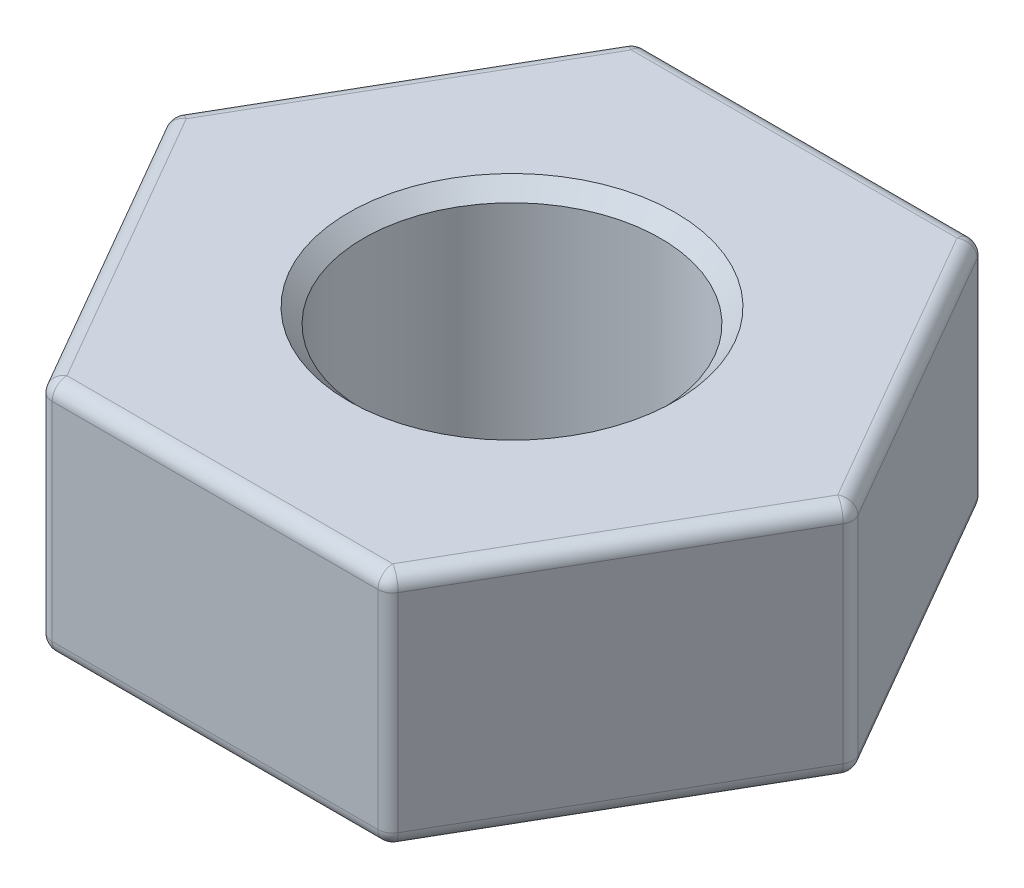
ISO-10303-21;
HEADER;
FILE_DESCRIPTION(('STEP AP214'),'2;1');
FILE_NAME('part.step','',(''),(''),'','','');
FILE_SCHEMA(('AUTOMOTIVE_DESIGN { 1 0 10303 214 1 1 1 1 }'));
ENDSEC;
DATA;
#1=APPLICATION_CONTEXT('core data for automotive mechanical design processes');
#2=APPLICATION_PROTOCOL_DEFINITION('international standard','automotive_design',2000,#1);
#3=PRODUCT_CONTEXT('',#1,'mechanical');
#4=PRODUCT('Part','Part','',(#3));
#5=PRODUCT_RELATED_PRODUCT_CATEGORY('part','',(#4));
#6=PRODUCT_DEFINITION_FORMATION('','',#4);
#7=PRODUCT_DEFINITION_CONTEXT('part definition',#1,'design');
#8=PRODUCT_DEFINITION('design','',#6,#7);
#9=PRODUCT_DEFINITION_SHAPE('','',#8);
#10=(LENGTH_UNIT() NAMED_UNIT(*) SI_UNIT(.MILLI.,.METRE.));
#11=(NAMED_UNIT(*) PLANE_ANGLE_UNIT() SI_UNIT($,.RADIAN.));
#12=(NAMED_UNIT(*) SI_UNIT($,.STERADIAN.) SOLID_ANGLE_UNIT());
#13=UNCERTAINTY_MEASURE_WITH_UNIT(LENGTH_MEASURE(1.E-05),#10,'distance_accuracy_value','');
#14=(GEOMETRIC_REPRESENTATION_CONTEXT(3) GLOBAL_UNCERTAINTY_ASSIGNED_CONTEXT((#13)) GLOBAL_UNIT_ASSIGNED_CONTEXT((#10,
#11,#12)) REPRESENTATION_CONTEXT('',''));
#15=CARTESIAN_POINT('',(0.,0.,0.));
#16=DIRECTION('',(0.,0.,1.));
#17=DIRECTION('',(1.,0.,0.));
#18=AXIS2_PLACEMENT_3D('',#15,#16,#17);
#19=CARTESIAN_POINT('',(0.,1.6,0.));
#20=DIRECTION('',(0.,1.,0.));
#21=DIRECTION('',(0.,0.,1.));
#22=AXIS2_PLACEMENT_3D('',#19,#20,#21);
#23=PLANE('',#22);
#24=CARTESIAN_POINT('',(0.,1.6,0.));
#25=DIRECTION('',(0.,1.,0.));
#26=DIRECTION('',(0.,0.,1.));
#27=AXIS2_PLACEMENT_3D('',#24,#25,#26);
#28=CIRCLE('',#27,1.1);
#29=CARTESIAN_POINT('',(0.,1.6,1.1));
#30=VERTEX_POINT('',#29);
#31=EDGE_CURVE('E11',#30,#30,#28,.F.);
#32=ORIENTED_EDGE('',*,*,#31,.T.);
#33=EDGE_LOOP('',(#32));
#34=FACE_BOUND('',#33,.T.);
#35=DIRECTION('',(-0.499999999999995,0.,0.866025403784442));
#36=VECTOR('',#35,1.);
#37=CARTESIAN_POINT('',(-2.22279853638006,1.6,0.0500000000000157));
#38=LINE('',#37,#36);
#39=CARTESIAN_POINT('',(-1.0969655114603,1.6,-1.9));
#40=VERTEX_POINT('',#39);
#41=CARTESIAN_POINT('',(-2.19393102292058,1.6,0.));
#42=VERTEX_POINT('',#41);
#43=EDGE_CURVE('E58',#40,#42,#38,.T.);
#44=ORIENTED_EDGE('',*,*,#43,.T.);
#45=DIRECTION('',(0.500000000000007,0.,0.866025403784435));
#46=VECTOR('',#45,1.);
#47=CARTESIAN_POINT('',(-1.06809799800079,1.6,1.95000000000001));
#48=LINE('',#47,#46);
#49=CARTESIAN_POINT('',(-1.09696551146027,1.6,1.90000000000001));
#50=VERTEX_POINT('',#49);
#51=EDGE_CURVE('E317',#42,#50,#48,.T.);
#52=ORIENTED_EDGE('',*,*,#51,.T.);
#53=DIRECTION('',(1.,0.,0.));
#54=VECTOR('',#53,1.);
#55=CARTESIAN_POINT('',(1.15470053837927,1.6,1.89999999999999));
#56=LINE('',#55,#54);
#57=CARTESIAN_POINT('',(1.09696551146031,1.6,1.89999999999999));
#58=VERTEX_POINT('',#57);
#59=EDGE_CURVE('E464',#50,#58,#56,.T.);
#60=ORIENTED_EDGE('',*,*,#59,.T.);
#61=DIRECTION('',(0.499999999999995,0.,-0.866025403784442));
#62=VECTOR('',#61,1.);
#63=CARTESIAN_POINT('',(2.22279853638006,1.6,-0.0500000000000001));
#64=LINE('',#63,#62);
#65=CARTESIAN_POINT('',(2.19393102292058,1.6,0.));
#66=VERTEX_POINT('',#65);
#67=EDGE_CURVE('E467',#58,#66,#64,.T.);
#68=ORIENTED_EDGE('',*,*,#67,.T.);
#69=DIRECTION('',(-0.500000000000001,0.,-0.866025403784438));
#70=VECTOR('',#69,1.);
#71=CARTESIAN_POINT('',(1.0680979980008,1.6,-1.95));
#72=LINE('',#71,#70);
#73=CARTESIAN_POINT('',(1.09696551146029,1.6,-1.9));
#74=VERTEX_POINT('',#73);
#75=EDGE_CURVE('E470',#66,#74,#72,.T.);
#76=ORIENTED_EDGE('',*,*,#75,.T.);
#77=DIRECTION('',(-1.,0.,0.));
#78=VECTOR('',#77,1.);
#79=CARTESIAN_POINT('',(-1.15470053837926,1.6,-1.9));
#80=LINE('',#79,#78);
#81=EDGE_CURVE('E63',#74,#40,#80,.T.);
#82=ORIENTED_EDGE('',*,*,#81,.T.);
#83=EDGE_LOOP('',(#44,#52,#60,#68,#76,#82));
#84=FACE_BOUND('',#83,.T.);
#85=ADVANCED_FACE('F41',(#34,#84),#23,.T.);
#86=CARTESIAN_POINT('',(0.,0.,0.));
#87=DIRECTION('',(0.,1.,0.));
#88=DIRECTION('',(0.,0.,1.));
#89=AXIS2_PLACEMENT_3D('',#86,#87,#88);
#90=PLANE('',#89);
#91=CARTESIAN_POINT('',(0.,0.,0.));
#92=DIRECTION('',(0.,1.,0.));
#93=DIRECTION('',(0.,0.,1.));
#94=AXIS2_PLACEMENT_3D('',#91,#92,#93);
#95=CIRCLE('',#94,1.1);
#96=CARTESIAN_POINT('',(0.,0.,1.1));
#97=VERTEX_POINT('',#96);
#98=EDGE_CURVE('E312',#97,#97,#95,.T.);
#99=ORIENTED_EDGE('',*,*,#98,.T.);
#100=EDGE_LOOP('',(#99));
#101=FACE_BOUND('',#100,.T.);
#102=DIRECTION('',(1.,0.,0.));
#103=VECTOR('',#102,1.);
#104=CARTESIAN_POINT('',(0.,0.,1.9));
#105=LINE('',#104,#103);
#106=CARTESIAN_POINT('',(1.09696551146031,0.,1.89999999999999));
#107=VERTEX_POINT('',#106);
#108=CARTESIAN_POINT('',(-1.09696551146027,0.,1.90000000000001));
#109=VERTEX_POINT('',#108);
#110=EDGE_CURVE('E340',#107,#109,#105,.F.);
#111=ORIENTED_EDGE('',*,*,#110,.T.);
#112=DIRECTION('',(0.500000000000007,0.,0.866025403784435));
#113=VECTOR('',#112,1.);
#114=CARTESIAN_POINT('',(-1.64544826719043,0.,0.950000000000013));
#115=LINE('',#114,#113);
#116=CARTESIAN_POINT('',(-2.19393102292058,0.,0.));
#117=VERTEX_POINT('',#116);
#118=EDGE_CURVE('E343',#109,#117,#115,.F.);
#119=ORIENTED_EDGE('',*,*,#118,.T.);
#120=DIRECTION('',(-0.499999999999995,0.,0.866025403784442));
#121=VECTOR('',#120,1.);
#122=CARTESIAN_POINT('',(-1.64544826719044,0.,-0.94999999999999));
#123=LINE('',#122,#121);
#124=CARTESIAN_POINT('',(-1.0969655114603,0.,-1.9));
#125=VERTEX_POINT('',#124);
#126=EDGE_CURVE('E369',#117,#125,#123,.F.);
#127=ORIENTED_EDGE('',*,*,#126,.T.);
#128=DIRECTION('',(-1.,0.,0.));
#129=VECTOR('',#128,1.);
#130=CARTESIAN_POINT('',(0.,0.,-1.9));
#131=LINE('',#130,#129);
#132=CARTESIAN_POINT('',(1.09696551146029,0.,-1.9));
#133=VERTEX_POINT('',#132);
#134=EDGE_CURVE('E396',#125,#133,#131,.F.);
#135=ORIENTED_EDGE('',*,*,#134,.T.);
#136=DIRECTION('',(-0.500000000000001,0.,-0.866025403784438));
#137=VECTOR('',#136,1.);
#138=CARTESIAN_POINT('',(1.64544826719043,0.,-0.950000000000002));
#139=LINE('',#138,#137);
#140=CARTESIAN_POINT('',(2.19393102292058,0.,0.));
#141=VERTEX_POINT('',#140);
#142=EDGE_CURVE('E399',#133,#141,#139,.F.);
#143=ORIENTED_EDGE('',*,*,#142,.T.);
#144=DIRECTION('',(0.499999999999995,0.,-0.866025403784442));
#145=VECTOR('',#144,1.);
#146=CARTESIAN_POINT('',(1.64544826719045,0.,0.949999999999995));
#147=LINE('',#146,#145);
#148=EDGE_CURVE('E345',#141,#107,#147,.F.);
#149=ORIENTED_EDGE('',*,*,#148,.T.);
#150=EDGE_LOOP('',(#111,#119,#127,#135,#143,#149));
#151=FACE_BOUND('',#150,.T.);
#152=ADVANCED_FACE('F333',(#101,#151),#90,.F.);
#153=CARTESIAN_POINT('',(1.15470053837928,1.6,1.99999999999999));
#154=DIRECTION('',(-0.866025403784441,0.,-0.499999999999995));
#155=DIRECTION('',(-0.499999999999995,0.,0.866025403784442));
#156=AXIS2_PLACEMENT_3D('',#153,#154,#155);
#157=PLANE('',#156);
#158=DIRECTION('',(0.,-1.,0.));
#159=VECTOR('',#158,1.);
#160=CARTESIAN_POINT('',(1.18356805183876,1.6,1.94999999999999));
#161=LINE('',#160,#159);
#162=CARTESIAN_POINT('',(1.18356805183876,1.5,1.94999999999999));
#163=VERTEX_POINT('',#162);
#164=CARTESIAN_POINT('',(1.18356805183876,0.1,1.94999999999999));
#165=VERTEX_POINT('',#164);
#166=EDGE_CURVE('E447',#163,#165,#161,.T.);
#167=ORIENTED_EDGE('',*,*,#166,.T.);
#168=DIRECTION('',(0.499999999999995,0.,-0.866025403784442));
#169=VECTOR('',#168,1.);
#170=CARTESIAN_POINT('',(1.15470053837928,0.1,1.99999999999999));
#171=LINE('',#170,#169);
#172=CARTESIAN_POINT('',(2.28053356329902,0.1,0.0499999999999998));
#173=VERTEX_POINT('',#172);
#174=EDGE_CURVE('E450',#165,#173,#171,.T.);
#175=ORIENTED_EDGE('',*,*,#174,.T.);
#176=DIRECTION('',(0.,-1.,0.));
#177=VECTOR('',#176,1.);
#178=CARTESIAN_POINT('',(2.28053356329902,1.6,0.0499999999999997));
#179=LINE('',#178,#177);
#180=CARTESIAN_POINT('',(2.28053356329902,1.5,0.0499999999999998));
#181=VERTEX_POINT('',#180);
#182=EDGE_CURVE('E444',#173,#181,#179,.F.);
#183=ORIENTED_EDGE('',*,*,#182,.T.);
#184=DIRECTION('',(0.499999999999995,0.,-0.866025403784442));
#185=VECTOR('',#184,1.);
#186=CARTESIAN_POINT('',(1.15470053837928,1.5,1.99999999999999));
#187=LINE('',#186,#185);
#188=EDGE_CURVE('E441',#181,#163,#187,.F.);
#189=ORIENTED_EDGE('',*,*,#188,.T.);
#190=EDGE_LOOP('',(#167,#175,#183,#189));
#191=FACE_BOUND('',#190,.T.);
#192=ADVANCED_FACE('F336',(#191),#157,.F.);
#193=CARTESIAN_POINT('',(2.30940107675851,1.6,0.));
#194=DIRECTION('',(-0.866025403784438,0.,0.500000000000001));
#195=DIRECTION('',(0.500000000000001,0.,0.866025403784438));
#196=AXIS2_PLACEMENT_3D('',#193,#194,#195);
#197=PLANE('',#196);
#198=DIRECTION('',(0.,-1.,0.));
#199=VECTOR('',#198,1.);
#200=CARTESIAN_POINT('',(2.28053356329902,1.6,-0.0499999999999998));
#201=LINE('',#200,#199);
#202=CARTESIAN_POINT('',(2.28053356329902,1.5,-0.0499999999999998));
#203=VERTEX_POINT('',#202);
#204=CARTESIAN_POINT('',(2.28053356329902,0.1,-0.0499999999999998));
#205=VERTEX_POINT('',#204);
#206=EDGE_CURVE('E431',#203,#205,#201,.T.);
#207=ORIENTED_EDGE('',*,*,#206,.T.);
#208=DIRECTION('',(-0.500000000000001,0.,-0.866025403784438));
#209=VECTOR('',#208,1.);
#210=CARTESIAN_POINT('',(2.30940107675851,0.1,0.));
#211=LINE('',#210,#209);
#212=CARTESIAN_POINT('',(1.18356805183873,0.1,-1.95));
#213=VERTEX_POINT('',#212);
#214=EDGE_CURVE('E437',#205,#213,#211,.T.);
#215=ORIENTED_EDGE('',*,*,#214,.T.);
#216=DIRECTION('',(0.,-1.,0.));
#217=VECTOR('',#216,1.);
#218=CARTESIAN_POINT('',(1.18356805183873,1.6,-1.95));
#219=LINE('',#218,#217);
#220=CARTESIAN_POINT('',(1.18356805183873,1.5,-1.95));
#221=VERTEX_POINT('',#220);
#222=EDGE_CURVE('E434',#213,#221,#219,.F.);
#223=ORIENTED_EDGE('',*,*,#222,.T.);
#224=DIRECTION('',(-0.500000000000001,0.,-0.866025403784438));
#225=VECTOR('',#224,1.);
#226=CARTESIAN_POINT('',(2.30940107675851,1.5,0.));
#227=LINE('',#226,#225);
#228=EDGE_CURVE('E428',#221,#203,#227,.F.);
#229=ORIENTED_EDGE('',*,*,#228,.T.);
#230=EDGE_LOOP('',(#207,#215,#223,#229));
#231=FACE_BOUND('',#230,.T.);
#232=ADVANCED_FACE('F543',(#231),#197,.F.);
#233=CARTESIAN_POINT('',(1.15470053837925,1.6,-2.));
#234=DIRECTION('',(0.,0.,1.));
#235=DIRECTION('',(1.,0.,0.));
#236=AXIS2_PLACEMENT_3D('',#233,#234,#235);
#237=PLANE('',#236);
#238=DIRECTION('',(0.,-1.,0.));
#239=VECTOR('',#238,1.);
#240=CARTESIAN_POINT('',(1.09696551146029,1.6,-2.));
#241=LINE('',#240,#239);
#242=CARTESIAN_POINT('',(1.09696551146029,1.5,-2.));
#243=VERTEX_POINT('',#242);
#244=CARTESIAN_POINT('',(1.09696551146029,0.1,-2.));
#245=VERTEX_POINT('',#244);
#246=EDGE_CURVE('E418',#243,#245,#241,.T.);
#247=ORIENTED_EDGE('',*,*,#246,.T.);
#248=DIRECTION('',(-1.,0.,0.));
#249=VECTOR('',#248,1.);
#250=CARTESIAN_POINT('',(1.15470053837925,0.1,-2.));
#251=LINE('',#250,#249);
#252=CARTESIAN_POINT('',(-1.0969655114603,0.1,-2.));
#253=VERTEX_POINT('',#252);
#254=EDGE_CURVE('E424',#245,#253,#251,.T.);
#255=ORIENTED_EDGE('',*,*,#254,.T.);
#256=DIRECTION('',(0.,-1.,0.));
#257=VECTOR('',#256,1.);
#258=CARTESIAN_POINT('',(-1.0969655114603,1.6,-2.));
#259=LINE('',#258,#257);
#260=CARTESIAN_POINT('',(-1.0969655114603,1.5,-2.));
#261=VERTEX_POINT('',#260);
#262=EDGE_CURVE('E421',#253,#261,#259,.F.);
#263=ORIENTED_EDGE('',*,*,#262,.T.);
#264=DIRECTION('',(-1.,0.,0.));
#265=VECTOR('',#264,1.);
#266=CARTESIAN_POINT('',(1.15470053837925,1.5,-2.));
#267=LINE('',#266,#265);
#268=EDGE_CURVE('E415',#261,#243,#267,.F.);
#269=ORIENTED_EDGE('',*,*,#268,.T.);
#270=EDGE_LOOP('',(#247,#255,#263,#269));
#271=FACE_BOUND('',#270,.T.);
#272=ADVANCED_FACE('F554',(#271),#237,.F.);
#273=CARTESIAN_POINT('',(-1.15470053837926,1.6,-2.));
#274=DIRECTION('',(0.866025403784442,0.,0.499999999999995));
#275=DIRECTION('',(0.499999999999995,0.,-0.866025403784442));
#276=AXIS2_PLACEMENT_3D('',#273,#274,#275);
#277=PLANE('',#276);
#278=DIRECTION('',(0.,-1.,0.));
#279=VECTOR('',#278,1.);
#280=CARTESIAN_POINT('',(-1.18356805183874,1.6,-1.95));
#281=LINE('',#280,#279);
#282=CARTESIAN_POINT('',(-1.18356805183874,1.5,-1.95));
#283=VERTEX_POINT('',#282);
#284=CARTESIAN_POINT('',(-1.18356805183874,0.1,-1.95));
#285=VERTEX_POINT('',#284);
#286=EDGE_CURVE('E405',#283,#285,#281,.T.);
#287=ORIENTED_EDGE('',*,*,#286,.T.);
#288=DIRECTION('',(-0.499999999999995,0.,0.866025403784442));
#289=VECTOR('',#288,1.);
#290=CARTESIAN_POINT('',(-1.15470053837926,0.1,-2.));
#291=LINE('',#290,#289);
#292=CARTESIAN_POINT('',(-2.28053356329902,0.1,-0.0499999999999842));
#293=VERTEX_POINT('',#292);
#294=EDGE_CURVE('E411',#285,#293,#291,.T.);
#295=ORIENTED_EDGE('',*,*,#294,.T.);
#296=DIRECTION('',(0.,-1.,0.));
#297=VECTOR('',#296,1.);
#298=CARTESIAN_POINT('',(-2.28053356329902,1.6,-0.0499999999999845));
#299=LINE('',#298,#297);
#300=CARTESIAN_POINT('',(-2.28053356329902,1.5,-0.0499999999999842));
#301=VERTEX_POINT('',#300);
#302=EDGE_CURVE('E408',#293,#301,#299,.F.);
#303=ORIENTED_EDGE('',*,*,#302,.T.);
#304=DIRECTION('',(-0.499999999999995,0.,0.866025403784442));
#305=VECTOR('',#304,1.);
#306=CARTESIAN_POINT('',(-1.15470053837926,1.5,-2.));
#307=LINE('',#306,#305);
#308=EDGE_CURVE('E368',#301,#283,#307,.F.);
#309=ORIENTED_EDGE('',*,*,#308,.T.);
#310=EDGE_LOOP('',(#287,#295,#303,#309));
#311=FACE_BOUND('',#310,.T.);
#312=ADVANCED_FACE('F569',(#311),#277,.F.);
#313=CARTESIAN_POINT('',(-2.3094010767585,1.6,0.));
#314=DIRECTION('',(0.866025403784435,0.,-0.500000000000007));
#315=DIRECTION('',(-0.500000000000007,0.,-0.866025403784435));
#316=AXIS2_PLACEMENT_3D('',#313,#314,#315);
#317=PLANE('',#316);
#318=DIRECTION('',(0.,-1.,0.));
#319=VECTOR('',#318,1.);
#320=CARTESIAN_POINT('',(-2.28053356329902,1.6,0.0500000000000159));
#321=LINE('',#320,#319);
#322=CARTESIAN_POINT('',(-2.28053356329902,1.5,0.0500000000000159));
#323=VERTEX_POINT('',#322);
#324=CARTESIAN_POINT('',(-2.28053356329902,0.1,0.0500000000000159));
#325=VERTEX_POINT('',#324);
#326=EDGE_CURVE('E179',#323,#325,#321,.T.);
#327=ORIENTED_EDGE('',*,*,#326,.T.);
#328=DIRECTION('',(0.500000000000007,0.,0.866025403784435));
#329=VECTOR('',#328,1.);
#330=CARTESIAN_POINT('',(-2.3094010767585,0.1,0.));
#331=LINE('',#330,#329);
#332=CARTESIAN_POINT('',(-1.18356805183872,0.1,1.95000000000001));
#333=VERTEX_POINT('',#332);
#334=EDGE_CURVE('E174',#325,#333,#331,.T.);
#335=ORIENTED_EDGE('',*,*,#334,.T.);
#336=DIRECTION('',(0.,-1.,0.));
#337=VECTOR('',#336,1.);
#338=CARTESIAN_POINT('',(-1.18356805183872,1.6,1.95000000000001));
#339=LINE('',#338,#337);
#340=CARTESIAN_POINT('',(-1.18356805183872,1.5,1.95000000000001));
#341=VERTEX_POINT('',#340);
#342=EDGE_CURVE('E168',#333,#341,#339,.F.);
#343=ORIENTED_EDGE('',*,*,#342,.T.);
#344=DIRECTION('',(0.500000000000007,0.,0.866025403784435));
#345=VECTOR('',#344,1.);
#346=CARTESIAN_POINT('',(-2.3094010767585,1.5,0.));
#347=LINE('',#346,#345);
#348=EDGE_CURVE('E171',#341,#323,#347,.F.);
#349=ORIENTED_EDGE('',*,*,#348,.T.);
#350=EDGE_LOOP('',(#327,#335,#343,#349));
#351=FACE_BOUND('',#350,.T.);
#352=ADVANCED_FACE('F170',(#351),#317,.F.);
#353=CARTESIAN_POINT('',(-1.15470053837923,1.6,2.00000000000001));
#354=DIRECTION('',(0.,0.,-1.));
#355=DIRECTION('',(-1.,0.,0.));
#356=AXIS2_PLACEMENT_3D('',#353,#354,#355);
#357=PLANE('',#356);
#358=DIRECTION('',(0.,-1.,0.));
#359=VECTOR('',#358,1.);
#360=CARTESIAN_POINT('',(-1.09696551146027,1.6,2.00000000000001));
#361=LINE('',#360,#359);
#362=CARTESIAN_POINT('',(-1.09696551146027,1.5,2.00000000000001));
#363=VERTEX_POINT('',#362);
#364=CARTESIAN_POINT('',(-1.09696551146027,0.1,2.00000000000001));
#365=VERTEX_POINT('',#364);
#366=EDGE_CURVE('E203',#363,#365,#361,.T.);
#367=ORIENTED_EDGE('',*,*,#366,.T.);
#368=DIRECTION('',(1.,0.,0.));
#369=VECTOR('',#368,1.);
#370=CARTESIAN_POINT('',(-1.15470053837923,0.1,2.00000000000001));
#371=LINE('',#370,#369);
#372=CARTESIAN_POINT('',(1.09696551146031,0.1,1.99999999999999));
#373=VERTEX_POINT('',#372);
#374=EDGE_CURVE('E355',#365,#373,#371,.T.);
#375=ORIENTED_EDGE('',*,*,#374,.T.);
#376=DIRECTION('',(0.,-1.,0.));
#377=VECTOR('',#376,1.);
#378=CARTESIAN_POINT('',(1.09696551146031,1.6,1.99999999999999));
#379=LINE('',#378,#377);
#380=CARTESIAN_POINT('',(1.09696551146031,1.5,1.99999999999999));
#381=VERTEX_POINT('',#380);
#382=EDGE_CURVE('E459',#373,#381,#379,.F.);
#383=ORIENTED_EDGE('',*,*,#382,.T.);
#384=DIRECTION('',(1.,0.,0.));
#385=VECTOR('',#384,1.);
#386=CARTESIAN_POINT('',(-1.15470053837923,1.5,2.00000000000001));
#387=LINE('',#386,#385);
#388=EDGE_CURVE('E454',#381,#363,#387,.F.);
#389=ORIENTED_EDGE('',*,*,#388,.T.);
#390=EDGE_LOOP('',(#367,#375,#383,#389));
#391=FACE_BOUND('',#390,.T.);
#392=ADVANCED_FACE('F518',(#391),#357,.F.);
#393=CARTESIAN_POINT('',(0.,1.6,0.));
#394=DIRECTION('',(0.,-1.,0.));
#395=DIRECTION('',(0.,0.,-1.));
#396=AXIS2_PLACEMENT_3D('',#393,#394,#395);
#397=CYLINDRICAL_SURFACE('',#396,1.);
#398=CARTESIAN_POINT('',(0.,0.100000000000001,0.));
#399=DIRECTION('',(0.,1.,0.));
#400=DIRECTION('',(0.,0.,1.));
#401=AXIS2_PLACEMENT_3D('',#398,#399,#400);
#402=CIRCLE('',#401,1.);
#403=CARTESIAN_POINT('',(0.,0.100000000000001,1.));
#404=VERTEX_POINT('',#403);
#405=EDGE_CURVE('E51',#404,#404,#402,.F.);
#406=ORIENTED_EDGE('',*,*,#405,.T.);
#407=EDGE_LOOP('',(#406));
#408=FACE_BOUND('',#407,.T.);
#409=CARTESIAN_POINT('',(0.,1.5,0.));
#410=DIRECTION('',(0.,1.,0.));
#411=DIRECTION('',(0.,0.,1.));
#412=AXIS2_PLACEMENT_3D('',#409,#410,#411);
#413=CIRCLE('',#412,1.);
#414=CARTESIAN_POINT('',(0.,1.5,1.));
#415=VERTEX_POINT('',#414);
#416=EDGE_CURVE('E316',#415,#415,#413,.T.);
#417=ORIENTED_EDGE('',*,*,#416,.T.);
#418=EDGE_LOOP('',(#417));
#419=FACE_BOUND('',#418,.T.);
#420=ADVANCED_FACE('F324',(#408,#419),#397,.F.);
#421=CARTESIAN_POINT('',(1.64544826719043,1.5,-0.950000000000002));
#422=DIRECTION('',(0.500000000000001,0.,0.866025403784438));
#423=DIRECTION('',(0.866025403784438,0.,-0.500000000000001));
#424=AXIS2_PLACEMENT_3D('',#421,#422,#423);
#425=CYLINDRICAL_SURFACE('',#424,0.1);
#426=CARTESIAN_POINT('',(1.09696551146029,1.5,-1.9));
#427=DIRECTION('',(-0.499999999999999,0.,-0.866025403784439));
#428=DIRECTION('',(-0.866025403784439,0.,0.499999999999999));
#429=AXIS2_PLACEMENT_3D('',#426,#427,#428);
#430=CIRCLE('',#429,0.1);
#431=EDGE_CURVE('E191',#74,#221,#430,.T.);
#432=ORIENTED_EDGE('',*,*,#431,.F.);
#433=ORIENTED_EDGE('',*,*,#75,.F.);
#434=CARTESIAN_POINT('',(2.19393102292058,1.5,0.));
#435=DIRECTION('',(0.500000000000002,0.,0.866025403784438));
#436=DIRECTION('',(0.866025403784438,0.,-0.500000000000002));
#437=AXIS2_PLACEMENT_3D('',#434,#435,#436);
#438=CIRCLE('',#437,0.1);
#439=EDGE_CURVE('E305',#203,#66,#438,.T.);
#440=ORIENTED_EDGE('',*,*,#439,.F.);
#441=ORIENTED_EDGE('',*,*,#228,.F.);
#442=EDGE_LOOP('',(#432,#433,#440,#441));
#443=FACE_BOUND('',#442,.T.);
#444=ADVANCED_FACE('F533',(#443),#425,.T.);
#445=CARTESIAN_POINT('',(1.09696551146029,1.5,-1.9));
#446=DIRECTION('',(0.,0.,1.));
#447=DIRECTION('',(1.,0.,0.));
#448=AXIS2_PLACEMENT_3D('',#445,#446,#447);
#449=SPHERICAL_SURFACE('',#448,0.1);
#450=CARTESIAN_POINT('',(1.09696551146029,1.5,-1.9));
#451=DIRECTION('',(1.,0.,0.));
#452=DIRECTION('',(0.,0.,-1.));
#453=AXIS2_PLACEMENT_3D('',#450,#451,#452);
#454=CIRCLE('',#453,0.1);
#455=EDGE_CURVE('E297',#74,#243,#454,.F.);
#456=ORIENTED_EDGE('',*,*,#455,.F.);
#457=ORIENTED_EDGE('',*,*,#431,.T.);
#458=CARTESIAN_POINT('',(1.09696551146029,1.5,-1.9));
#459=DIRECTION('',(0.,1.,0.));
#460=DIRECTION('',(0.,0.,1.));
#461=AXIS2_PLACEMENT_3D('',#458,#459,#460);
#462=CIRCLE('',#461,0.1);
#463=EDGE_CURVE('E301',#243,#221,#462,.F.);
#464=ORIENTED_EDGE('',*,*,#463,.F.);
#465=EDGE_LOOP('',(#456,#457,#464));
#466=FACE_BOUND('',#465,.T.);
#467=ADVANCED_FACE('F547',(#466),#449,.T.);
#468=CARTESIAN_POINT('',(2.19393102292058,1.5,0.));
#469=DIRECTION('',(0.,0.,1.));
#470=DIRECTION('',(1.,0.,0.));
#471=AXIS2_PLACEMENT_3D('',#468,#469,#470);
#472=SPHERICAL_SURFACE('',#471,0.1);
#473=CARTESIAN_POINT('',(2.19393102292058,1.5,0.));
#474=DIRECTION('',(0.,1.,0.));
#475=DIRECTION('',(0.,0.,1.));
#476=AXIS2_PLACEMENT_3D('',#473,#474,#475);
#477=CIRCLE('',#476,0.1);
#478=EDGE_CURVE('E289',#203,#181,#477,.F.);
#479=ORIENTED_EDGE('',*,*,#478,.F.);
#480=ORIENTED_EDGE('',*,*,#439,.T.);
#481=CARTESIAN_POINT('',(2.19393102292058,1.5,0.));
#482=DIRECTION('',(0.499999999999997,0.,-0.86602540378444));
#483=DIRECTION('',(-0.86602540378444,0.,-0.499999999999997));
#484=AXIS2_PLACEMENT_3D('',#481,#482,#483);
#485=CIRCLE('',#484,0.1);
#486=EDGE_CURVE('E293',#181,#66,#485,.F.);
#487=ORIENTED_EDGE('',*,*,#486,.F.);
#488=EDGE_LOOP('',(#479,#480,#487));
#489=FACE_BOUND('',#488,.T.);
#490=ADVANCED_FACE('F538',(#489),#472,.T.);
#491=CARTESIAN_POINT('',(1.09696551146029,1.6,-1.9));
#492=DIRECTION('',(0.,-1.,0.));
#493=DIRECTION('',(0.,0.,-1.));
#494=AXIS2_PLACEMENT_3D('',#491,#492,#493);
#495=CYLINDRICAL_SURFACE('',#494,0.1);
#496=ORIENTED_EDGE('',*,*,#463,.T.);
#497=ORIENTED_EDGE('',*,*,#222,.F.);
#498=CARTESIAN_POINT('',(1.09696551146029,0.1,-1.9));
#499=DIRECTION('',(0.,-1.,0.));
#500=DIRECTION('',(0.,0.,-1.));
#501=AXIS2_PLACEMENT_3D('',#498,#499,#500);
#502=CIRCLE('',#501,0.1);
#503=EDGE_CURVE('E282',#245,#213,#502,.T.);
#504=ORIENTED_EDGE('',*,*,#503,.F.);
#505=ORIENTED_EDGE('',*,*,#246,.F.);
#506=EDGE_LOOP('',(#496,#497,#504,#505));
#507=FACE_BOUND('',#506,.T.);
#508=ADVANCED_FACE('F550',(#507),#495,.T.);
#509=CARTESIAN_POINT('',(0.,1.5,-1.9));
#510=DIRECTION('',(1.,0.,0.));
#511=DIRECTION('',(0.,0.,-1.));
#512=AXIS2_PLACEMENT_3D('',#509,#510,#511);
#513=CYLINDRICAL_SURFACE('',#512,0.1);
#514=ORIENTED_EDGE('',*,*,#455,.T.);
#515=ORIENTED_EDGE('',*,*,#268,.F.);
#516=CARTESIAN_POINT('',(-1.0969655114603,1.5,-1.9));
#517=DIRECTION('',(-1.,0.,0.));
#518=DIRECTION('',(0.,0.,1.));
#519=AXIS2_PLACEMENT_3D('',#516,#517,#518);
#520=CIRCLE('',#519,0.1);
#521=EDGE_CURVE('E278',#40,#261,#520,.T.);
#522=ORIENTED_EDGE('',*,*,#521,.F.);
#523=ORIENTED_EDGE('',*,*,#81,.F.);
#524=EDGE_LOOP('',(#514,#515,#522,#523));
#525=FACE_BOUND('',#524,.T.);
#526=ADVANCED_FACE('F559',(#525),#513,.T.);
#527=CARTESIAN_POINT('',(1.64544826719045,1.5,0.949999999999995));
#528=DIRECTION('',(-0.499999999999995,0.,0.866025403784442));
#529=DIRECTION('',(0.866025403784441,0.,0.499999999999995));
#530=AXIS2_PLACEMENT_3D('',#527,#528,#529);
#531=CYLINDRICAL_SURFACE('',#530,0.1);
#532=ORIENTED_EDGE('',*,*,#486,.T.);
#533=ORIENTED_EDGE('',*,*,#67,.F.);
#534=CARTESIAN_POINT('',(1.09696551146031,1.5,1.89999999999999));
#535=DIRECTION('',(-0.499999999999995,0.,0.866025403784441));
#536=DIRECTION('',(0.866025403784441,0.,0.499999999999995));
#537=AXIS2_PLACEMENT_3D('',#534,#535,#536);
#538=CIRCLE('',#537,0.1);
#539=EDGE_CURVE('E274',#163,#58,#538,.T.);
#540=ORIENTED_EDGE('',*,*,#539,.F.);
#541=ORIENTED_EDGE('',*,*,#188,.F.);
#542=EDGE_LOOP('',(#532,#533,#540,#541));
#543=FACE_BOUND('',#542,.T.);
#544=ADVANCED_FACE('F527',(#543),#531,.T.);
#545=CARTESIAN_POINT('',(2.19393102292058,1.6,0.));
#546=DIRECTION('',(0.,-1.,0.));
#547=DIRECTION('',(0.,0.,-1.));
#548=AXIS2_PLACEMENT_3D('',#545,#546,#547);
#549=CYLINDRICAL_SURFACE('',#548,0.1);
#550=ORIENTED_EDGE('',*,*,#478,.T.);
#551=ORIENTED_EDGE('',*,*,#182,.F.);
#552=CARTESIAN_POINT('',(2.19393102292058,0.1,0.));
#553=DIRECTION('',(0.,-1.,0.));
#554=DIRECTION('',(0.,0.,-1.));
#555=AXIS2_PLACEMENT_3D('',#552,#553,#554);
#556=CIRCLE('',#555,0.1);
#557=EDGE_CURVE('E270',#205,#173,#556,.T.);
#558=ORIENTED_EDGE('',*,*,#557,.F.);
#559=ORIENTED_EDGE('',*,*,#206,.F.);
#560=EDGE_LOOP('',(#550,#551,#558,#559));
#561=FACE_BOUND('',#560,.T.);
#562=ADVANCED_FACE('F541',(#561),#549,.T.);
#563=CARTESIAN_POINT('',(2.22279853638006,0.1,0.0500000000000001));
#564=DIRECTION('',(-0.500000000000001,0.,-0.866025403784438));
#565=DIRECTION('',(-0.866025403784438,0.,0.500000000000001));
#566=AXIS2_PLACEMENT_3D('',#563,#564,#565);
#567=CYLINDRICAL_SURFACE('',#566,0.1);
#568=CARTESIAN_POINT('',(1.09696551146029,0.1,-1.9));
#569=DIRECTION('',(-0.500000000000001,0.,-0.866025403784438));
#570=DIRECTION('',(-0.866025403784438,0.,0.500000000000001));
#571=AXIS2_PLACEMENT_3D('',#568,#569,#570);
#572=CIRCLE('',#571,0.1);
#573=EDGE_CURVE('E285',#213,#133,#572,.T.);
#574=ORIENTED_EDGE('',*,*,#573,.F.);
#575=ORIENTED_EDGE('',*,*,#214,.F.);
#576=CARTESIAN_POINT('',(2.19393102292058,0.1,0.));
#577=DIRECTION('',(0.500000000000001,0.,0.866025403784438));
#578=DIRECTION('',(0.866025403784438,0.,-0.500000000000001));
#579=AXIS2_PLACEMENT_3D('',#576,#577,#578);
#580=CIRCLE('',#579,0.1);
#581=EDGE_CURVE('E266',#141,#205,#580,.T.);
#582=ORIENTED_EDGE('',*,*,#581,.F.);
#583=ORIENTED_EDGE('',*,*,#142,.F.);
#584=EDGE_LOOP('',(#574,#575,#582,#583));
#585=FACE_BOUND('',#584,.T.);
#586=ADVANCED_FACE('F499',(#585),#567,.T.);
#587=CARTESIAN_POINT('',(1.09696551146029,0.1,-1.9));
#588=DIRECTION('',(0.,0.,1.));
#589=DIRECTION('',(1.,0.,0.));
#590=AXIS2_PLACEMENT_3D('',#587,#588,#589);
#591=SPHERICAL_SURFACE('',#590,0.1);
#592=ORIENTED_EDGE('',*,*,#503,.T.);
#593=ORIENTED_EDGE('',*,*,#573,.T.);
#594=CARTESIAN_POINT('',(1.09696551146029,0.1,-1.9));
#595=DIRECTION('',(1.,0.,0.));
#596=DIRECTION('',(0.,0.,-1.));
#597=AXIS2_PLACEMENT_3D('',#594,#595,#596);
#598=CIRCLE('',#597,0.1);
#599=EDGE_CURVE('E262',#245,#133,#598,.F.);
#600=ORIENTED_EDGE('',*,*,#599,.F.);
#601=EDGE_LOOP('',(#592,#593,#600));
#602=FACE_BOUND('',#601,.T.);
#603=ADVANCED_FACE('F615',(#602),#591,.T.);
#604=CARTESIAN_POINT('',(-1.0969655114603,1.5,-1.9));
#605=DIRECTION('',(0.,0.,1.));
#606=DIRECTION('',(1.,0.,0.));
#607=AXIS2_PLACEMENT_3D('',#604,#605,#606);
#608=SPHERICAL_SURFACE('',#607,0.1);
#609=CARTESIAN_POINT('',(-1.0969655114603,1.5,-1.9));
#610=DIRECTION('',(0.499999999999995,0.,-0.866025403784441));
#611=DIRECTION('',(-0.866025403784441,0.,-0.499999999999995));
#612=AXIS2_PLACEMENT_3D('',#609,#610,#611);
#613=CIRCLE('',#612,0.1);
#614=EDGE_CURVE('E254',#40,#283,#613,.F.);
#615=ORIENTED_EDGE('',*,*,#614,.F.);
#616=ORIENTED_EDGE('',*,*,#521,.T.);
#617=CARTESIAN_POINT('',(-1.0969655114603,1.5,-1.9));
#618=DIRECTION('',(0.,1.,0.));
#619=DIRECTION('',(0.,0.,1.));
#620=AXIS2_PLACEMENT_3D('',#617,#618,#619);
#621=CIRCLE('',#620,0.1);
#622=EDGE_CURVE('E258',#283,#261,#621,.F.);
#623=ORIENTED_EDGE('',*,*,#622,.F.);
#624=EDGE_LOOP('',(#615,#616,#623));
#625=FACE_BOUND('',#624,.T.);
#626=ADVANCED_FACE('F563',(#625),#608,.T.);
#627=CARTESIAN_POINT('',(1.09696551146031,1.5,1.89999999999999));
#628=DIRECTION('',(0.,0.,1.));
#629=DIRECTION('',(1.,0.,0.));
#630=AXIS2_PLACEMENT_3D('',#627,#628,#629);
#631=SPHERICAL_SURFACE('',#630,0.1);
#632=CARTESIAN_POINT('',(1.09696551146031,1.5,1.89999999999999));
#633=DIRECTION('',(0.,1.,0.));
#634=DIRECTION('',(0.,0.,1.));
#635=AXIS2_PLACEMENT_3D('',#632,#633,#634);
#636=CIRCLE('',#635,0.1);
#637=EDGE_CURVE('E246',#163,#381,#636,.F.);
#638=ORIENTED_EDGE('',*,*,#637,.F.);
#639=ORIENTED_EDGE('',*,*,#539,.T.);
#640=CARTESIAN_POINT('',(1.09696551146031,1.5,1.89999999999999));
#641=DIRECTION('',(1.,0.,0.));
#642=DIRECTION('',(0.,0.,-1.));
#643=AXIS2_PLACEMENT_3D('',#640,#641,#642);
#644=CIRCLE('',#643,0.1);
#645=EDGE_CURVE('E250',#381,#58,#644,.F.);
#646=ORIENTED_EDGE('',*,*,#645,.F.);
#647=EDGE_LOOP('',(#638,#639,#646));
#648=FACE_BOUND('',#647,.T.);
#649=ADVANCED_FACE('F523',(#648),#631,.T.);
#650=CARTESIAN_POINT('',(2.19393102292058,0.1,0.));
#651=DIRECTION('',(0.,0.,1.));
#652=DIRECTION('',(1.,0.,0.));
#653=AXIS2_PLACEMENT_3D('',#650,#651,#652);
#654=SPHERICAL_SURFACE('',#653,0.1);
#655=ORIENTED_EDGE('',*,*,#581,.T.);
#656=ORIENTED_EDGE('',*,*,#557,.T.);
#657=CARTESIAN_POINT('',(2.19393102292058,0.1,0.));
#658=DIRECTION('',(0.499999999999995,0.,-0.866025403784441));
#659=DIRECTION('',(-0.866025403784441,0.,-0.499999999999995));
#660=AXIS2_PLACEMENT_3D('',#657,#658,#659);
#661=CIRCLE('',#660,0.1);
#662=EDGE_CURVE('E243',#141,#173,#661,.F.);
#663=ORIENTED_EDGE('',*,*,#662,.F.);
#664=EDGE_LOOP('',(#655,#656,#663));
#665=FACE_BOUND('',#664,.T.);
#666=ADVANCED_FACE('F502',(#665),#654,.T.);
#667=CARTESIAN_POINT('',(1.15470053837925,0.1,-1.9));
#668=DIRECTION('',(-1.,0.,0.));
#669=DIRECTION('',(0.,0.,1.));
#670=AXIS2_PLACEMENT_3D('',#667,#668,#669);
#671=CYLINDRICAL_SURFACE('',#670,0.1);
#672=ORIENTED_EDGE('',*,*,#599,.T.);
#673=ORIENTED_EDGE('',*,*,#134,.F.);
#674=CARTESIAN_POINT('',(-1.0969655114603,0.1,-1.9));
#675=DIRECTION('',(-1.,0.,0.));
#676=DIRECTION('',(0.,0.,1.));
#677=AXIS2_PLACEMENT_3D('',#674,#675,#676);
#678=CIRCLE('',#677,0.1);
#679=EDGE_CURVE('E239',#253,#125,#678,.T.);
#680=ORIENTED_EDGE('',*,*,#679,.F.);
#681=ORIENTED_EDGE('',*,*,#254,.F.);
#682=EDGE_LOOP('',(#672,#673,#680,#681));
#683=FACE_BOUND('',#682,.T.);
#684=ADVANCED_FACE('F625',(#683),#671,.T.);
#685=CARTESIAN_POINT('',(-1.0969655114603,1.6,-1.9));
#686=DIRECTION('',(0.,-1.,0.));
#687=DIRECTION('',(0.,0.,-1.));
#688=AXIS2_PLACEMENT_3D('',#685,#686,#687);
#689=CYLINDRICAL_SURFACE('',#688,0.1);
#690=ORIENTED_EDGE('',*,*,#622,.T.);
#691=ORIENTED_EDGE('',*,*,#262,.F.);
#692=CARTESIAN_POINT('',(-1.0969655114603,0.1,-1.9));
#693=DIRECTION('',(0.,-1.,0.));
#694=DIRECTION('',(0.,0.,-1.));
#695=AXIS2_PLACEMENT_3D('',#692,#693,#694);
#696=CIRCLE('',#695,0.1);
#697=EDGE_CURVE('E236',#285,#253,#696,.T.);
#698=ORIENTED_EDGE('',*,*,#697,.F.);
#699=ORIENTED_EDGE('',*,*,#286,.F.);
#700=EDGE_LOOP('',(#690,#691,#698,#699));
#701=FACE_BOUND('',#700,.T.);
#702=ADVANCED_FACE('F567',(#701),#689,.T.);
#703=CARTESIAN_POINT('',(-1.64544826719044,1.5,-0.94999999999999));
#704=DIRECTION('',(0.499999999999995,0.,-0.866025403784442));
#705=DIRECTION('',(-0.866025403784442,0.,-0.499999999999995));
#706=AXIS2_PLACEMENT_3D('',#703,#704,#705);
#707=CYLINDRICAL_SURFACE('',#706,0.1);
#708=ORIENTED_EDGE('',*,*,#614,.T.);
#709=ORIENTED_EDGE('',*,*,#308,.F.);
#710=CARTESIAN_POINT('',(-2.19393102292058,1.5,0.));
#711=DIRECTION('',(-0.499999999999994,0.,0.866025403784442));
#712=DIRECTION('',(0.866025403784442,0.,0.499999999999994));
#713=AXIS2_PLACEMENT_3D('',#710,#711,#712);
#714=CIRCLE('',#713,0.1);
#715=EDGE_CURVE('E232',#42,#301,#714,.T.);
#716=ORIENTED_EDGE('',*,*,#715,.F.);
#717=ORIENTED_EDGE('',*,*,#43,.F.);
#718=EDGE_LOOP('',(#708,#709,#716,#717));
#719=FACE_BOUND('',#718,.T.);
#720=ADVANCED_FACE('F480',(#719),#707,.T.);
#721=CARTESIAN_POINT('',(-1.64544826719043,1.5,0.950000000000013));
#722=DIRECTION('',(-0.500000000000007,0.,-0.866025403784435));
#723=DIRECTION('',(-0.866025403784435,0.,0.500000000000007));
#724=AXIS2_PLACEMENT_3D('',#721,#722,#723);
#725=CYLINDRICAL_SURFACE('',#724,0.1);
#726=CARTESIAN_POINT('',(-1.09696551146027,1.5,1.90000000000001));
#727=DIRECTION('',(0.500000000000007,0.,0.866025403784435));
#728=DIRECTION('',(0.866025403784435,0.,-0.500000000000007));
#729=AXIS2_PLACEMENT_3D('',#726,#727,#728);
#730=CIRCLE('',#729,0.1);
#731=EDGE_CURVE('E185',#50,#341,#730,.T.);
#732=ORIENTED_EDGE('',*,*,#731,.F.);
#733=ORIENTED_EDGE('',*,*,#51,.F.);
#734=CARTESIAN_POINT('',(-2.19393102292058,1.5,0.));
#735=DIRECTION('',(-0.500000000000006,0.,-0.866025403784435));
#736=DIRECTION('',(-0.866025403784435,0.,0.500000000000006));
#737=AXIS2_PLACEMENT_3D('',#734,#735,#736);
#738=CIRCLE('',#737,0.1);
#739=EDGE_CURVE('E188',#323,#42,#738,.T.);
#740=ORIENTED_EDGE('',*,*,#739,.F.);
#741=ORIENTED_EDGE('',*,*,#348,.F.);
#742=EDGE_LOOP('',(#732,#733,#740,#741));
#743=FACE_BOUND('',#742,.T.);
#744=ADVANCED_FACE('F184',(#743),#725,.T.);
#745=CARTESIAN_POINT('',(0.,1.5,1.9));
#746=DIRECTION('',(-1.,0.,0.));
#747=DIRECTION('',(0.,0.,1.));
#748=AXIS2_PLACEMENT_3D('',#745,#746,#747);
#749=CYLINDRICAL_SURFACE('',#748,0.1);
#750=ORIENTED_EDGE('',*,*,#645,.T.);
#751=ORIENTED_EDGE('',*,*,#59,.F.);
#752=CARTESIAN_POINT('',(-1.09696551146027,1.5,1.90000000000001));
#753=DIRECTION('',(-1.,0.,0.));
#754=DIRECTION('',(0.,0.,1.));
#755=AXIS2_PLACEMENT_3D('',#752,#753,#754);
#756=CIRCLE('',#755,0.1);
#757=EDGE_CURVE('E199',#363,#50,#756,.T.);
#758=ORIENTED_EDGE('',*,*,#757,.F.);
#759=ORIENTED_EDGE('',*,*,#388,.F.);
#760=EDGE_LOOP('',(#750,#751,#758,#759));
#761=FACE_BOUND('',#760,.T.);
#762=ADVANCED_FACE('F521',(#761),#749,.T.);
#763=CARTESIAN_POINT('',(1.09696551146031,1.6,1.89999999999999));
#764=DIRECTION('',(0.,-1.,0.));
#765=DIRECTION('',(0.,0.,-1.));
#766=AXIS2_PLACEMENT_3D('',#763,#764,#765);
#767=CYLINDRICAL_SURFACE('',#766,0.1);
#768=ORIENTED_EDGE('',*,*,#637,.T.);
#769=ORIENTED_EDGE('',*,*,#382,.F.);
#770=CARTESIAN_POINT('',(1.09696551146031,0.1,1.89999999999999));
#771=DIRECTION('',(0.,-1.,0.));
#772=DIRECTION('',(0.,0.,-1.));
#773=AXIS2_PLACEMENT_3D('',#770,#771,#772);
#774=CIRCLE('',#773,0.1);
#775=EDGE_CURVE('E224',#165,#373,#774,.T.);
#776=ORIENTED_EDGE('',*,*,#775,.F.);
#777=ORIENTED_EDGE('',*,*,#166,.F.);
#778=EDGE_LOOP('',(#768,#769,#776,#777));
#779=FACE_BOUND('',#778,.T.);
#780=ADVANCED_FACE('F514',(#779),#767,.T.);
#781=CARTESIAN_POINT('',(1.06809799800083,0.1,1.94999999999999));
#782=DIRECTION('',(0.499999999999995,0.,-0.866025403784442));
#783=DIRECTION('',(-0.866025403784441,0.,-0.499999999999995));
#784=AXIS2_PLACEMENT_3D('',#781,#782,#783);
#785=CYLINDRICAL_SURFACE('',#784,0.1);
#786=ORIENTED_EDGE('',*,*,#662,.T.);
#787=ORIENTED_EDGE('',*,*,#174,.F.);
#788=CARTESIAN_POINT('',(1.09696551146031,0.1,1.89999999999999));
#789=DIRECTION('',(-0.499999999999995,0.,0.866025403784441));
#790=DIRECTION('',(0.866025403784442,0.,0.499999999999995));
#791=AXIS2_PLACEMENT_3D('',#788,#789,#790);
#792=CIRCLE('',#791,0.1);
#793=EDGE_CURVE('E220',#107,#165,#792,.T.);
#794=ORIENTED_EDGE('',*,*,#793,.F.);
#795=ORIENTED_EDGE('',*,*,#148,.F.);
#796=EDGE_LOOP('',(#786,#787,#794,#795));
#797=FACE_BOUND('',#796,.T.);
#798=ADVANCED_FACE('F506',(#797),#785,.T.);
#799=CARTESIAN_POINT('',(-1.0969655114603,0.1,-1.9));
#800=DIRECTION('',(0.,0.,1.));
#801=DIRECTION('',(1.,0.,0.));
#802=AXIS2_PLACEMENT_3D('',#799,#800,#801);
#803=SPHERICAL_SURFACE('',#802,0.1);
#804=ORIENTED_EDGE('',*,*,#697,.T.);
#805=ORIENTED_EDGE('',*,*,#679,.T.);
#806=CARTESIAN_POINT('',(-1.0969655114603,0.1,-1.9));
#807=DIRECTION('',(0.499999999999995,0.,-0.866025403784441));
#808=DIRECTION('',(-0.866025403784442,0.,-0.499999999999995));
#809=AXIS2_PLACEMENT_3D('',#806,#807,#808);
#810=CIRCLE('',#809,0.1);
#811=EDGE_CURVE('E211',#285,#125,#810,.F.);
#812=ORIENTED_EDGE('',*,*,#811,.F.);
#813=EDGE_LOOP('',(#804,#805,#812));
#814=FACE_BOUND('',#813,.T.);
#815=ADVANCED_FACE('F641',(#814),#803,.T.);
#816=CARTESIAN_POINT('',(-2.19393102292058,1.5,0.));
#817=DIRECTION('',(0.,0.,1.));
#818=DIRECTION('',(1.,0.,0.));
#819=AXIS2_PLACEMENT_3D('',#816,#817,#818);
#820=SPHERICAL_SURFACE('',#819,0.1);
#821=ORIENTED_EDGE('',*,*,#739,.T.);
#822=ORIENTED_EDGE('',*,*,#715,.T.);
#823=CARTESIAN_POINT('',(-2.19393102292058,1.5,0.));
#824=DIRECTION('',(0.,1.,0.));
#825=DIRECTION('',(0.,0.,1.));
#826=AXIS2_PLACEMENT_3D('',#823,#824,#825);
#827=CIRCLE('',#826,0.1);
#828=EDGE_CURVE('E205',#323,#301,#827,.F.);
#829=ORIENTED_EDGE('',*,*,#828,.F.);
#830=EDGE_LOOP('',(#821,#822,#829));
#831=FACE_BOUND('',#830,.T.);
#832=ADVANCED_FACE('F482',(#831),#820,.T.);
#833=CARTESIAN_POINT('',(-1.09696551146027,1.5,1.90000000000001));
#834=DIRECTION('',(0.,0.,1.));
#835=DIRECTION('',(1.,0.,0.));
#836=AXIS2_PLACEMENT_3D('',#833,#834,#835);
#837=SPHERICAL_SURFACE('',#836,0.1);
#838=ORIENTED_EDGE('',*,*,#757,.T.);
#839=ORIENTED_EDGE('',*,*,#731,.T.);
#840=CARTESIAN_POINT('',(-1.09696551146027,1.5,1.90000000000001));
#841=DIRECTION('',(0.,1.,0.));
#842=DIRECTION('',(0.,0.,1.));
#843=AXIS2_PLACEMENT_3D('',#840,#841,#842);
#844=CIRCLE('',#843,0.1);
#845=EDGE_CURVE('E196',#363,#341,#844,.F.);
#846=ORIENTED_EDGE('',*,*,#845,.F.);
#847=EDGE_LOOP('',(#838,#839,#846));
#848=FACE_BOUND('',#847,.T.);
#849=ADVANCED_FACE('F195',(#848),#837,.T.);
#850=CARTESIAN_POINT('',(1.09696551146031,0.1,1.89999999999999));
#851=DIRECTION('',(0.,0.,1.));
#852=DIRECTION('',(1.,0.,0.));
#853=AXIS2_PLACEMENT_3D('',#850,#851,#852);
#854=SPHERICAL_SURFACE('',#853,0.1);
#855=ORIENTED_EDGE('',*,*,#793,.T.);
#856=ORIENTED_EDGE('',*,*,#775,.T.);
#857=CARTESIAN_POINT('',(1.09696551146031,0.1,1.89999999999999));
#858=DIRECTION('',(1.,0.,0.));
#859=DIRECTION('',(0.,0.,-1.));
#860=AXIS2_PLACEMENT_3D('',#857,#858,#859);
#861=CIRCLE('',#860,0.1);
#862=EDGE_CURVE('E206',#107,#373,#861,.F.);
#863=ORIENTED_EDGE('',*,*,#862,.F.);
#864=EDGE_LOOP('',(#855,#856,#863));
#865=FACE_BOUND('',#864,.T.);
#866=ADVANCED_FACE('F510',(#865),#854,.T.);
#867=CARTESIAN_POINT('',(-1.06809799800082,0.1,-1.95));
#868=DIRECTION('',(-0.499999999999995,0.,0.866025403784442));
#869=DIRECTION('',(0.866025403784442,0.,0.499999999999995));
#870=AXIS2_PLACEMENT_3D('',#867,#868,#869);
#871=CYLINDRICAL_SURFACE('',#870,0.1);
#872=ORIENTED_EDGE('',*,*,#811,.T.);
#873=ORIENTED_EDGE('',*,*,#126,.F.);
#874=CARTESIAN_POINT('',(-2.19393102292058,0.1,0.));
#875=DIRECTION('',(-0.499999999999995,0.,0.866025403784441));
#876=DIRECTION('',(0.866025403784442,0.,0.499999999999995));
#877=AXIS2_PLACEMENT_3D('',#874,#875,#876);
#878=CIRCLE('',#877,0.1);
#879=EDGE_CURVE('E213',#293,#117,#878,.T.);
#880=ORIENTED_EDGE('',*,*,#879,.F.);
#881=ORIENTED_EDGE('',*,*,#294,.F.);
#882=EDGE_LOOP('',(#872,#873,#880,#881));
#883=FACE_BOUND('',#882,.T.);
#884=ADVANCED_FACE('F392',(#883),#871,.T.);
#885=CARTESIAN_POINT('',(-2.19393102292058,1.6,0.));
#886=DIRECTION('',(0.,-1.,0.));
#887=DIRECTION('',(0.,0.,-1.));
#888=AXIS2_PLACEMENT_3D('',#885,#886,#887);
#889=CYLINDRICAL_SURFACE('',#888,0.1);
#890=ORIENTED_EDGE('',*,*,#828,.T.);
#891=ORIENTED_EDGE('',*,*,#302,.F.);
#892=CARTESIAN_POINT('',(-2.19393102292058,0.1,0.));
#893=DIRECTION('',(0.,-1.,0.));
#894=DIRECTION('',(0.,0.,-1.));
#895=AXIS2_PLACEMENT_3D('',#892,#893,#894);
#896=CIRCLE('',#895,0.1);
#897=EDGE_CURVE('E381',#325,#293,#896,.T.);
#898=ORIENTED_EDGE('',*,*,#897,.F.);
#899=ORIENTED_EDGE('',*,*,#326,.F.);
#900=EDGE_LOOP('',(#890,#891,#898,#899));
#901=FACE_BOUND('',#900,.T.);
#902=ADVANCED_FACE('F485',(#901),#889,.T.);
#903=CARTESIAN_POINT('',(-1.09696551146027,1.6,1.90000000000001));
#904=DIRECTION('',(0.,-1.,0.));
#905=DIRECTION('',(0.,0.,-1.));
#906=AXIS2_PLACEMENT_3D('',#903,#904,#905);
#907=CYLINDRICAL_SURFACE('',#906,0.1);
#908=ORIENTED_EDGE('',*,*,#845,.T.);
#909=ORIENTED_EDGE('',*,*,#342,.F.);
#910=CARTESIAN_POINT('',(-1.09696551146027,0.1,1.90000000000001));
#911=DIRECTION('',(0.,-1.,0.));
#912=DIRECTION('',(0.,0.,-1.));
#913=AXIS2_PLACEMENT_3D('',#910,#911,#912);
#914=CIRCLE('',#913,0.1);
#915=EDGE_CURVE('E360',#365,#333,#914,.T.);
#916=ORIENTED_EDGE('',*,*,#915,.F.);
#917=ORIENTED_EDGE('',*,*,#366,.F.);
#918=EDGE_LOOP('',(#908,#909,#916,#917));
#919=FACE_BOUND('',#918,.T.);
#920=ADVANCED_FACE('F202',(#919),#907,.T.);
#921=CARTESIAN_POINT('',(-1.15470053837924,0.1,1.90000000000001));
#922=DIRECTION('',(1.,0.,0.));
#923=DIRECTION('',(0.,0.,-1.));
#924=AXIS2_PLACEMENT_3D('',#921,#922,#923);
#925=CYLINDRICAL_SURFACE('',#924,0.1);
#926=ORIENTED_EDGE('',*,*,#862,.T.);
#927=ORIENTED_EDGE('',*,*,#374,.F.);
#928=CARTESIAN_POINT('',(-1.09696551146027,0.1,1.90000000000001));
#929=DIRECTION('',(-1.,0.,0.));
#930=DIRECTION('',(0.,0.,1.));
#931=AXIS2_PLACEMENT_3D('',#928,#929,#930);
#932=CIRCLE('',#931,0.1);
#933=EDGE_CURVE('E352',#109,#365,#932,.T.);
#934=ORIENTED_EDGE('',*,*,#933,.F.);
#935=ORIENTED_EDGE('',*,*,#110,.F.);
#936=EDGE_LOOP('',(#926,#927,#934,#935));
#937=FACE_BOUND('',#936,.T.);
#938=ADVANCED_FACE('F353',(#937),#925,.T.);
#939=CARTESIAN_POINT('',(-2.19393102292058,0.1,0.));
#940=DIRECTION('',(0.,0.,1.));
#941=DIRECTION('',(1.,0.,0.));
#942=AXIS2_PLACEMENT_3D('',#939,#940,#941);
#943=SPHERICAL_SURFACE('',#942,0.1);
#944=ORIENTED_EDGE('',*,*,#897,.T.);
#945=ORIENTED_EDGE('',*,*,#879,.T.);
#946=CARTESIAN_POINT('',(-2.19393102292058,0.1,0.));
#947=DIRECTION('',(-0.500000000000007,0.,-0.866025403784435));
#948=DIRECTION('',(-0.866025403784435,0.,0.500000000000007));
#949=AXIS2_PLACEMENT_3D('',#946,#947,#948);
#950=CIRCLE('',#949,0.1);
#951=EDGE_CURVE('E361',#325,#117,#950,.F.);
#952=ORIENTED_EDGE('',*,*,#951,.F.);
#953=EDGE_LOOP('',(#944,#945,#952));
#954=FACE_BOUND('',#953,.T.);
#955=ADVANCED_FACE('F387',(#954),#943,.T.);
#956=CARTESIAN_POINT('',(-1.09696551146027,0.1,1.90000000000001));
#957=DIRECTION('',(0.,0.,1.));
#958=DIRECTION('',(1.,0.,0.));
#959=AXIS2_PLACEMENT_3D('',#956,#957,#958);
#960=SPHERICAL_SURFACE('',#959,0.1);
#961=ORIENTED_EDGE('',*,*,#933,.T.);
#962=ORIENTED_EDGE('',*,*,#915,.T.);
#963=CARTESIAN_POINT('',(-1.09696551146027,0.1,1.90000000000001));
#964=DIRECTION('',(0.500000000000008,0.,0.866025403784434));
#965=DIRECTION('',(0.866025403784434,0.,-0.500000000000008));
#966=AXIS2_PLACEMENT_3D('',#963,#964,#965);
#967=CIRCLE('',#966,0.1);
#968=EDGE_CURVE('E364',#109,#333,#967,.F.);
#969=ORIENTED_EDGE('',*,*,#968,.F.);
#970=EDGE_LOOP('',(#961,#962,#969));
#971=FACE_BOUND('',#970,.T.);
#972=ADVANCED_FACE('F371',(#971),#960,.T.);
#973=CARTESIAN_POINT('',(-2.22279853638006,0.1,-0.0499999999999846));
#974=DIRECTION('',(0.500000000000007,0.,0.866025403784435));
#975=DIRECTION('',(0.866025403784435,0.,-0.500000000000007));
#976=AXIS2_PLACEMENT_3D('',#973,#974,#975);
#977=CYLINDRICAL_SURFACE('',#976,0.1);
#978=ORIENTED_EDGE('',*,*,#951,.T.);
#979=ORIENTED_EDGE('',*,*,#118,.F.);
#980=ORIENTED_EDGE('',*,*,#968,.T.);
#981=ORIENTED_EDGE('',*,*,#334,.F.);
#982=EDGE_LOOP('',(#978,#979,#980,#981));
#983=FACE_BOUND('',#982,.T.);
#984=ADVANCED_FACE('F330',(#983),#977,.T.);
#985=CARTESIAN_POINT('',(0.,0.,0.));
#986=DIRECTION('',(0.,-1.,0.));
#987=DIRECTION('',(0.,0.,-1.));
#988=AXIS2_PLACEMENT_3D('',#985,#986,#987);
#989=CONICAL_SURFACE('',#988,1.1,0.785398163397444);
#990=ORIENTED_EDGE('',*,*,#405,.F.);
#991=EDGE_LOOP('',(#990));
#992=FACE_BOUND('',#991,.T.);
#993=ORIENTED_EDGE('',*,*,#98,.F.);
#994=EDGE_LOOP('',(#993));
#995=FACE_BOUND('',#994,.T.);
#996=ADVANCED_FACE('F327',(#992,#995),#989,.F.);
#997=CARTESIAN_POINT('',(0.,1.5,0.));
#998=DIRECTION('',(0.,1.,0.));
#999=DIRECTION('',(0.,0.,1.));
#1000=AXIS2_PLACEMENT_3D('',#997,#998,#999);
#1001=CONICAL_SURFACE('',#1000,1.,0.785398163397447);
#1002=ORIENTED_EDGE('',*,*,#31,.F.);
#1003=EDGE_LOOP('',(#1002));
#1004=FACE_BOUND('',#1003,.T.);
#1005=ORIENTED_EDGE('',*,*,#416,.F.);
#1006=EDGE_LOOP('',(#1005));
#1007=FACE_BOUND('',#1006,.T.);
#1008=ADVANCED_FACE('F44',(#1004,#1007),#1001,.F.);
#1009=CLOSED_SHELL('',(#85,#152,#192,#232,#272,#312,#352,#392,#420,#444,#467,#490,#508,#526,
#544,#562,#586,#603,#626,#649,#666,#684,#702,#720,#744,#762,#780,#798,#815,#832,#849,#866,#884,
#902,#920,#938,#955,#972,#984,#996,#1008));
#1010=MANIFOLD_SOLID_BREP('B2',#1009);
#1011=ADVANCED_BREP_SHAPE_REPRESENTATION('',(#18,#1010),#14);
#1012=SHAPE_DEFINITION_REPRESENTATION(#9,#1011);
ENDSEC;
END-ISO-10303-21;
